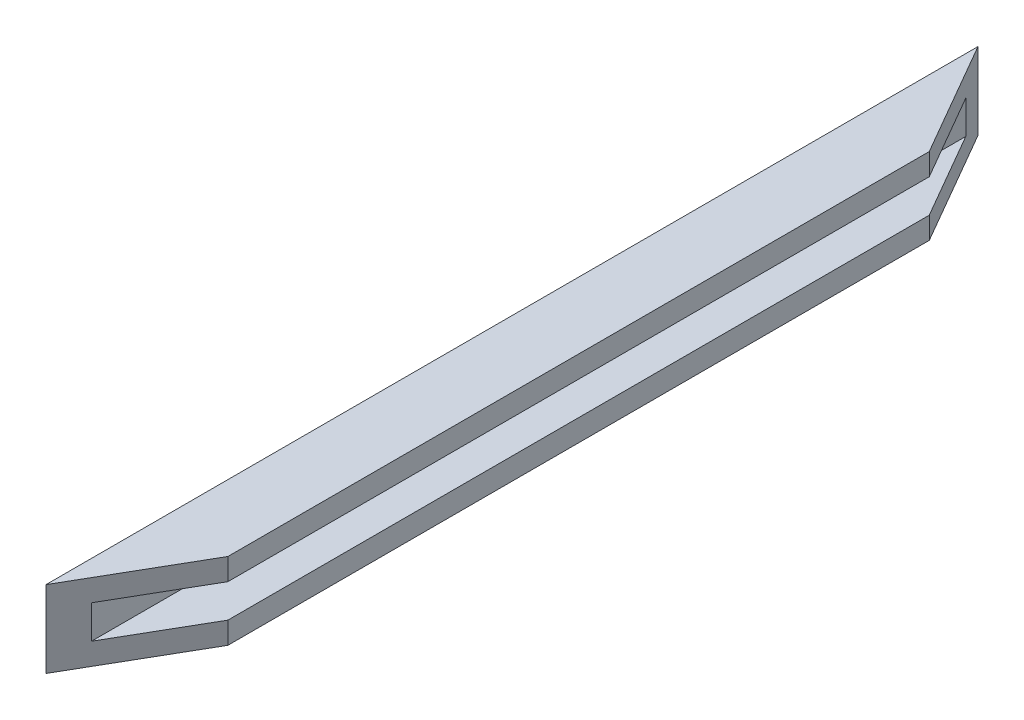
ISO-10303-21;
HEADER;
FILE_DESCRIPTION(('STEP AP214'),'2;1');
FILE_NAME('part.step','',(''),(''),'','','');
FILE_SCHEMA(('AUTOMOTIVE_DESIGN { 1 0 10303 214 1 1 1 1 }'));
ENDSEC;
DATA;
#1=APPLICATION_CONTEXT('core data for automotive mechanical design processes');
#2=APPLICATION_PROTOCOL_DEFINITION('international standard','automotive_design',2000,#1);
#3=PRODUCT_CONTEXT('',#1,'mechanical');
#4=PRODUCT('Part','Part','',(#3));
#5=PRODUCT_RELATED_PRODUCT_CATEGORY('part','',(#4));
#6=PRODUCT_DEFINITION_FORMATION('','',#4);
#7=PRODUCT_DEFINITION_CONTEXT('part definition',#1,'design');
#8=PRODUCT_DEFINITION('design','',#6,#7);
#9=PRODUCT_DEFINITION_SHAPE('','',#8);
#10=(LENGTH_UNIT() NAMED_UNIT(*) SI_UNIT(.MILLI.,.METRE.));
#11=(NAMED_UNIT(*) PLANE_ANGLE_UNIT() SI_UNIT($,.RADIAN.));
#12=(NAMED_UNIT(*) SI_UNIT($,.STERADIAN.) SOLID_ANGLE_UNIT());
#13=UNCERTAINTY_MEASURE_WITH_UNIT(LENGTH_MEASURE(1.E-05),#10,'distance_accuracy_value','');
#14=(GEOMETRIC_REPRESENTATION_CONTEXT(3) GLOBAL_UNCERTAINTY_ASSIGNED_CONTEXT((#13)) GLOBAL_UNIT_ASSIGNED_CONTEXT((#10,
#11,#12)) REPRESENTATION_CONTEXT('',''));
#15=CARTESIAN_POINT('',(0.,0.,0.));
#16=DIRECTION('',(0.,0.,1.));
#17=DIRECTION('',(1.,0.,0.));
#18=AXIS2_PLACEMENT_3D('',#15,#16,#17);
#19=CARTESIAN_POINT('',(6.35,0.,0.));
#20=DIRECTION('',(-1.,0.,0.));
#21=DIRECTION('',(0.,0.,1.));
#22=AXIS2_PLACEMENT_3D('',#19,#20,#21);
#23=PLANE('',#22);
#24=DIRECTION('',(0.,0.,-1.));
#25=VECTOR('',#24,1.);
#26=CARTESIAN_POINT('',(6.35,7.3406,0.));
#27=LINE('',#26,#25);
#28=CARTESIAN_POINT('',(6.34999999999999,7.3406,-10.9985226280623));
#29=VERTEX_POINT('',#28);
#30=CARTESIAN_POINT('',(6.35,7.3406,-77.9014773719377));
#31=VERTEX_POINT('',#30);
#32=EDGE_CURVE('E144',#29,#31,#27,.T.);
#33=ORIENTED_EDGE('',*,*,#32,.F.);
#34=DIRECTION('',(0.,-1.,0.));
#35=VECTOR('',#34,1.);
#36=CARTESIAN_POINT('',(6.34999999999999,7.3406,-10.9985226280623));
#37=LINE('',#36,#35);
#38=CARTESIAN_POINT('',(6.34999999999999,5.25780000000002,-10.9985226280623));
#39=VERTEX_POINT('',#38);
#40=EDGE_CURVE('E109',#29,#39,#37,.T.);
#41=ORIENTED_EDGE('',*,*,#40,.T.);
#42=DIRECTION('',(0.,0.,-1.));
#43=VECTOR('',#42,1.);
#44=CARTESIAN_POINT('',(6.35,5.25780000000002,0.));
#45=LINE('',#44,#43);
#46=CARTESIAN_POINT('',(6.35,5.25780000000001,-77.9014773719377));
#47=VERTEX_POINT('',#46);
#48=EDGE_CURVE('E155',#39,#47,#45,.T.);
#49=ORIENTED_EDGE('',*,*,#48,.T.);
#50=DIRECTION('',(0.,-1.,0.));
#51=VECTOR('',#50,1.);
#52=CARTESIAN_POINT('',(6.35,7.3406,-77.9014773719377));
#53=LINE('',#52,#51);
#54=EDGE_CURVE('E176',#31,#47,#53,.T.);
#55=ORIENTED_EDGE('',*,*,#54,.F.);
#56=EDGE_LOOP('',(#33,#41,#49,#55));
#57=FACE_BOUND('',#56,.T.);
#58=ADVANCED_FACE('F39',(#57),#23,.F.);
#59=CARTESIAN_POINT('',(6.35,0.,0.));
#60=DIRECTION('',(0.,1.,0.));
#61=DIRECTION('',(0.,0.,1.));
#62=AXIS2_PLACEMENT_3D('',#59,#60,#61);
#63=PLANE('',#62);
#64=DIRECTION('',(0.,0.,-1.));
#65=VECTOR('',#64,1.);
#66=CARTESIAN_POINT('',(6.35,0.,0.));
#67=LINE('',#66,#65);
#68=CARTESIAN_POINT('',(6.34999999999999,0.,-10.9985226280623));
#69=VERTEX_POINT('',#68);
#70=CARTESIAN_POINT('',(6.35,0.,-77.9014773719377));
#71=VERTEX_POINT('',#70);
#72=EDGE_CURVE('E138',#69,#71,#67,.T.);
#73=ORIENTED_EDGE('',*,*,#72,.F.);
#74=DIRECTION('',(0.500000000000001,0.,-0.866025403784438));
#75=VECTOR('',#74,1.);
#76=CARTESIAN_POINT('',(0.,0.,0.));
#77=LINE('',#76,#75);
#78=CARTESIAN_POINT('',(0.,0.,0.));
#79=VERTEX_POINT('',#78);
#80=EDGE_CURVE('E115',#79,#69,#77,.T.);
#81=ORIENTED_EDGE('',*,*,#80,.F.);
#82=DIRECTION('',(0.,0.,-1.));
#83=VECTOR('',#82,1.);
#84=CARTESIAN_POINT('',(0.,0.,0.));
#85=LINE('',#84,#83);
#86=CARTESIAN_POINT('',(0.,0.,-88.9));
#87=VERTEX_POINT('',#86);
#88=EDGE_CURVE('E129',#79,#87,#85,.T.);
#89=ORIENTED_EDGE('',*,*,#88,.T.);
#90=DIRECTION('',(-0.500000000000002,0.,-0.866025403784438));
#91=VECTOR('',#90,1.);
#92=CARTESIAN_POINT('',(0.,0.,-88.9));
#93=LINE('',#92,#91);
#94=EDGE_CURVE('E180',#71,#87,#93,.T.);
#95=ORIENTED_EDGE('',*,*,#94,.F.);
#96=EDGE_LOOP('',(#73,#81,#89,#95));
#97=FACE_BOUND('',#96,.T.);
#98=ADVANCED_FACE('F247',(#97),#63,.F.);
#99=CARTESIAN_POINT('',(6.35,7.3406,0.));
#100=DIRECTION('',(0.,1.,0.));
#101=DIRECTION('',(0.,0.,1.));
#102=AXIS2_PLACEMENT_3D('',#99,#100,#101);
#103=PLANE('',#102);
#104=DIRECTION('',(0.500000000000001,0.,-0.866025403784438));
#105=VECTOR('',#104,1.);
#106=CARTESIAN_POINT('',(0.,7.3406,0.));
#107=LINE('',#106,#105);
#108=CARTESIAN_POINT('',(0.,7.3406,0.));
#109=VERTEX_POINT('',#108);
#110=EDGE_CURVE('E102',#109,#29,#107,.T.);
#111=ORIENTED_EDGE('',*,*,#110,.T.);
#112=ORIENTED_EDGE('',*,*,#32,.T.);
#113=DIRECTION('',(-0.500000000000002,0.,-0.866025403784438));
#114=VECTOR('',#113,1.);
#115=CARTESIAN_POINT('',(0.,7.3406,-88.9));
#116=LINE('',#115,#114);
#117=CARTESIAN_POINT('',(0.,7.3406,-88.9));
#118=VERTEX_POINT('',#117);
#119=EDGE_CURVE('E120',#31,#118,#116,.T.);
#120=ORIENTED_EDGE('',*,*,#119,.T.);
#121=DIRECTION('',(0.,0.,-1.));
#122=VECTOR('',#121,1.);
#123=CARTESIAN_POINT('',(0.,7.3406,0.));
#124=LINE('',#123,#122);
#125=EDGE_CURVE('E119',#109,#118,#124,.T.);
#126=ORIENTED_EDGE('',*,*,#125,.F.);
#127=EDGE_LOOP('',(#111,#112,#120,#126));
#128=FACE_BOUND('',#127,.T.);
#129=ADVANCED_FACE('F41',(#128),#103,.T.);
#130=DIRECTION('',(0.,0.,-1.));
#131=VECTOR('',#130,1.);
#132=CARTESIAN_POINT('',(6.35,2.08280000000002,0.));
#133=LINE('',#132,#131);
#134=CARTESIAN_POINT('',(6.34999999999999,2.08280000000002,-10.9985226280623));
#135=VERTEX_POINT('',#134);
#136=CARTESIAN_POINT('',(6.35,2.08280000000001,-77.9014773719377));
#137=VERTEX_POINT('',#136);
#138=EDGE_CURVE('E159',#135,#137,#133,.T.);
#139=ORIENTED_EDGE('',*,*,#138,.F.);
#140=EDGE_CURVE('E114',#135,#69,#37,.T.);
#141=ORIENTED_EDGE('',*,*,#140,.T.);
#142=ORIENTED_EDGE('',*,*,#72,.T.);
#143=EDGE_CURVE('E179',#137,#71,#53,.T.);
#144=ORIENTED_EDGE('',*,*,#143,.F.);
#145=EDGE_LOOP('',(#139,#141,#142,#144));
#146=FACE_BOUND('',#145,.T.);
#147=ADVANCED_FACE('F227',(#146),#23,.F.);
#148=CARTESIAN_POINT('',(0.,0.,0.));
#149=DIRECTION('',(-1.,0.,0.));
#150=DIRECTION('',(0.,0.,1.));
#151=AXIS2_PLACEMENT_3D('',#148,#149,#150);
#152=PLANE('',#151);
#153=CARTESIAN_POINT('',(0.,3.67029999999998,-76.2));
#154=DIRECTION('',(-1.,0.,0.));
#155=DIRECTION('',(0.,0.,1.));
#156=AXIS2_PLACEMENT_3D('',#153,#154,#155);
#157=CIRCLE('',#156,1.025);
#158=CARTESIAN_POINT('',(0.,3.67029999999998,-75.175));
#159=VERTEX_POINT('',#158);
#160=EDGE_CURVE('E206',#159,#159,#157,.T.);
#161=ORIENTED_EDGE('',*,*,#160,.F.);
#162=EDGE_LOOP('',(#161));
#163=FACE_BOUND('',#162,.T.);
#164=CARTESIAN_POINT('',(0.,3.67029999999999,-44.45));
#165=DIRECTION('',(-1.,0.,0.));
#166=DIRECTION('',(0.,0.,1.));
#167=AXIS2_PLACEMENT_3D('',#164,#165,#166);
#168=CIRCLE('',#167,1.025);
#169=CARTESIAN_POINT('',(0.,3.67029999999999,-43.425));
#170=VERTEX_POINT('',#169);
#171=EDGE_CURVE('E198',#170,#170,#168,.T.);
#172=ORIENTED_EDGE('',*,*,#171,.F.);
#173=EDGE_LOOP('',(#172));
#174=FACE_BOUND('',#173,.T.);
#175=CARTESIAN_POINT('',(0.,3.67029999999998,-12.7));
#176=DIRECTION('',(-1.,0.,0.));
#177=DIRECTION('',(0.,0.,-1.));
#178=AXIS2_PLACEMENT_3D('',#175,#176,#177);
#179=CIRCLE('',#178,1.025);
#180=CARTESIAN_POINT('',(0.,3.67029999999998,-13.725));
#181=VERTEX_POINT('',#180);
#182=EDGE_CURVE('E190',#181,#181,#179,.T.);
#183=ORIENTED_EDGE('',*,*,#182,.F.);
#184=EDGE_LOOP('',(#183));
#185=FACE_BOUND('',#184,.T.);
#186=DIRECTION('',(0.,1.,0.));
#187=VECTOR('',#186,1.);
#188=CARTESIAN_POINT('',(0.,0.,0.));
#189=LINE('',#188,#187);
#190=EDGE_CURVE('E106',#79,#109,#189,.T.);
#191=ORIENTED_EDGE('',*,*,#190,.T.);
#192=ORIENTED_EDGE('',*,*,#125,.T.);
#193=DIRECTION('',(0.,1.,0.));
#194=VECTOR('',#193,1.);
#195=CARTESIAN_POINT('',(0.,0.,-88.9));
#196=LINE('',#195,#194);
#197=EDGE_CURVE('E124',#87,#118,#196,.T.);
#198=ORIENTED_EDGE('',*,*,#197,.F.);
#199=ORIENTED_EDGE('',*,*,#88,.F.);
#200=EDGE_LOOP('',(#191,#192,#198,#199));
#201=FACE_BOUND('',#200,.T.);
#202=ADVANCED_FACE('F127',(#163,#174,#185,#201),#152,.T.);
#203=CARTESIAN_POINT('',(1.5875,5.25780000000002,0.));
#204=DIRECTION('',(0.,-1.,0.));
#205=DIRECTION('',(0.,0.,-1.));
#206=AXIS2_PLACEMENT_3D('',#203,#204,#205);
#207=PLANE('',#206);
#208=DIRECTION('',(0.500000000000001,0.,-0.866025403784438));
#209=VECTOR('',#208,1.);
#210=CARTESIAN_POINT('',(0.396874999999998,5.25780000000002,-0.687407664253892));
#211=LINE('',#210,#209);
#212=CARTESIAN_POINT('',(1.5875,5.25780000000002,-2.74963065701558));
#213=VERTEX_POINT('',#212);
#214=EDGE_CURVE('E162',#213,#39,#211,.T.);
#215=ORIENTED_EDGE('',*,*,#214,.F.);
#216=DIRECTION('',(0.,0.,-1.));
#217=VECTOR('',#216,1.);
#218=CARTESIAN_POINT('',(1.5875,5.25780000000002,0.));
#219=LINE('',#218,#217);
#220=CARTESIAN_POINT('',(1.5875,5.25780000000001,-86.1503693429844));
#221=VERTEX_POINT('',#220);
#222=EDGE_CURVE('E131',#213,#221,#219,.T.);
#223=ORIENTED_EDGE('',*,*,#222,.T.);
#224=DIRECTION('',(-0.500000000000002,0.,-0.866025403784438));
#225=VECTOR('',#224,1.);
#226=CARTESIAN_POINT('',(38.8917041982184,5.25780000000002,-21.5375923357462));
#227=LINE('',#226,#225);
#228=EDGE_CURVE('E55',#47,#221,#227,.T.);
#229=ORIENTED_EDGE('',*,*,#228,.F.);
#230=ORIENTED_EDGE('',*,*,#48,.F.);
#231=EDGE_LOOP('',(#215,#223,#229,#230));
#232=FACE_BOUND('',#231,.T.);
#233=ADVANCED_FACE('F226',(#232),#207,.T.);
#234=CARTESIAN_POINT('',(1.5875,2.08280000000002,0.));
#235=DIRECTION('',(0.,-1.,0.));
#236=DIRECTION('',(0.,0.,-1.));
#237=AXIS2_PLACEMENT_3D('',#234,#235,#236);
#238=PLANE('',#237);
#239=DIRECTION('',(0.,0.,-1.));
#240=VECTOR('',#239,1.);
#241=CARTESIAN_POINT('',(1.5875,2.08280000000002,0.));
#242=LINE('',#241,#240);
#243=CARTESIAN_POINT('',(1.5875,2.08280000000002,-2.74963065701558));
#244=VERTEX_POINT('',#243);
#245=CARTESIAN_POINT('',(1.5875,2.08280000000001,-86.1503693429844));
#246=VERTEX_POINT('',#245);
#247=EDGE_CURVE('E135',#244,#246,#242,.T.);
#248=ORIENTED_EDGE('',*,*,#247,.F.);
#249=DIRECTION('',(0.500000000000001,0.,-0.866025403784438));
#250=VECTOR('',#249,1.);
#251=CARTESIAN_POINT('',(0.396874999999998,2.08280000000002,-0.687407664253892));
#252=LINE('',#251,#250);
#253=EDGE_CURVE('E62',#244,#135,#252,.T.);
#254=ORIENTED_EDGE('',*,*,#253,.T.);
#255=ORIENTED_EDGE('',*,*,#138,.T.);
#256=DIRECTION('',(-0.500000000000002,0.,-0.866025403784438));
#257=VECTOR('',#256,1.);
#258=CARTESIAN_POINT('',(38.8917041982184,2.08280000000002,-21.5375923357462));
#259=LINE('',#258,#257);
#260=EDGE_CURVE('E173',#137,#246,#259,.T.);
#261=ORIENTED_EDGE('',*,*,#260,.T.);
#262=EDGE_LOOP('',(#248,#254,#255,#261));
#263=FACE_BOUND('',#262,.T.);
#264=ADVANCED_FACE('F262',(#263),#238,.F.);
#265=CARTESIAN_POINT('',(1.5875,0.,0.));
#266=DIRECTION('',(1.,0.,0.));
#267=DIRECTION('',(0.,0.,-1.));
#268=AXIS2_PLACEMENT_3D('',#265,#266,#267);
#269=PLANE('',#268);
#270=CARTESIAN_POINT('',(1.5875,3.67029999999998,-76.2));
#271=DIRECTION('',(-1.,0.,0.));
#272=DIRECTION('',(0.,0.,1.));
#273=AXIS2_PLACEMENT_3D('',#270,#271,#272);
#274=CIRCLE('',#273,1.025);
#275=CARTESIAN_POINT('',(1.5875,3.67029999999998,-75.175));
#276=VERTEX_POINT('',#275);
#277=EDGE_CURVE('E183',#276,#276,#274,.T.);
#278=ORIENTED_EDGE('',*,*,#277,.T.);
#279=EDGE_LOOP('',(#278));
#280=FACE_BOUND('',#279,.T.);
#281=CARTESIAN_POINT('',(1.5875,3.67029999999999,-44.45));
#282=DIRECTION('',(-1.,0.,0.));
#283=DIRECTION('',(0.,0.,1.));
#284=AXIS2_PLACEMENT_3D('',#281,#282,#283);
#285=CIRCLE('',#284,1.025);
#286=CARTESIAN_POINT('',(1.5875,3.67029999999999,-43.425));
#287=VERTEX_POINT('',#286);
#288=EDGE_CURVE('E202',#287,#287,#285,.T.);
#289=ORIENTED_EDGE('',*,*,#288,.T.);
#290=EDGE_LOOP('',(#289));
#291=FACE_BOUND('',#290,.T.);
#292=CARTESIAN_POINT('',(1.5875,3.67029999999998,-12.7));
#293=DIRECTION('',(-1.,0.,0.));
#294=DIRECTION('',(0.,0.,-1.));
#295=AXIS2_PLACEMENT_3D('',#292,#293,#294);
#296=CIRCLE('',#295,1.025);
#297=CARTESIAN_POINT('',(1.5875,3.67029999999998,-13.725));
#298=VERTEX_POINT('',#297);
#299=EDGE_CURVE('E194',#298,#298,#296,.T.);
#300=ORIENTED_EDGE('',*,*,#299,.T.);
#301=EDGE_LOOP('',(#300));
#302=FACE_BOUND('',#301,.T.);
#303=DIRECTION('',(0.,1.,0.));
#304=VECTOR('',#303,1.);
#305=CARTESIAN_POINT('',(1.5875,0.,-2.74963065701558));
#306=LINE('',#305,#304);
#307=EDGE_CURVE('E11',#244,#213,#306,.T.);
#308=ORIENTED_EDGE('',*,*,#307,.F.);
#309=ORIENTED_EDGE('',*,*,#247,.T.);
#310=DIRECTION('',(0.,-1.,0.));
#311=VECTOR('',#310,1.);
#312=CARTESIAN_POINT('',(1.5875,0.,-86.1503693429844));
#313=LINE('',#312,#311);
#314=EDGE_CURVE('E48',#221,#246,#313,.T.);
#315=ORIENTED_EDGE('',*,*,#314,.F.);
#316=ORIENTED_EDGE('',*,*,#222,.F.);
#317=EDGE_LOOP('',(#308,#309,#315,#316));
#318=FACE_BOUND('',#317,.T.);
#319=ADVANCED_FACE('F214',(#280,#291,#302,#318),#269,.T.);
#320=CARTESIAN_POINT('',(0.,7.3406,-88.9));
#321=DIRECTION('',(-0.866025403784438,0.,0.500000000000002));
#322=DIRECTION('',(0.500000000000002,0.,0.866025403784438));
#323=AXIS2_PLACEMENT_3D('',#320,#321,#322);
#324=PLANE('',#323);
#325=ORIENTED_EDGE('',*,*,#228,.T.);
#326=ORIENTED_EDGE('',*,*,#314,.T.);
#327=ORIENTED_EDGE('',*,*,#260,.F.);
#328=ORIENTED_EDGE('',*,*,#143,.T.);
#329=ORIENTED_EDGE('',*,*,#94,.T.);
#330=ORIENTED_EDGE('',*,*,#197,.T.);
#331=ORIENTED_EDGE('',*,*,#119,.F.);
#332=ORIENTED_EDGE('',*,*,#54,.T.);
#333=EDGE_LOOP('',(#325,#326,#327,#328,#329,#330,#331,#332));
#334=FACE_BOUND('',#333,.T.);
#335=ADVANCED_FACE('F243',(#334),#324,.F.);
#336=CARTESIAN_POINT('',(0.,7.3406,0.));
#337=DIRECTION('',(-0.866025403784438,0.,-0.500000000000001));
#338=DIRECTION('',(-0.500000000000001,0.,0.866025403784438));
#339=AXIS2_PLACEMENT_3D('',#336,#337,#338);
#340=PLANE('',#339);
#341=ORIENTED_EDGE('',*,*,#214,.T.);
#342=ORIENTED_EDGE('',*,*,#40,.F.);
#343=ORIENTED_EDGE('',*,*,#110,.F.);
#344=ORIENTED_EDGE('',*,*,#190,.F.);
#345=ORIENTED_EDGE('',*,*,#80,.T.);
#346=ORIENTED_EDGE('',*,*,#140,.F.);
#347=ORIENTED_EDGE('',*,*,#253,.F.);
#348=ORIENTED_EDGE('',*,*,#307,.T.);
#349=EDGE_LOOP('',(#341,#342,#343,#344,#345,#346,#347,#348));
#350=FACE_BOUND('',#349,.T.);
#351=ADVANCED_FACE('F104',(#350),#340,.F.);
#352=CARTESIAN_POINT('',(1.5875,3.67029999999998,-12.7));
#353=DIRECTION('',(-1.,0.,0.));
#354=DIRECTION('',(0.,0.,1.));
#355=AXIS2_PLACEMENT_3D('',#352,#353,#354);
#356=CYLINDRICAL_SURFACE('',#355,1.025);
#357=ORIENTED_EDGE('',*,*,#299,.F.);
#358=EDGE_LOOP('',(#357));
#359=FACE_BOUND('',#358,.T.);
#360=ORIENTED_EDGE('',*,*,#182,.T.);
#361=EDGE_LOOP('',(#360));
#362=FACE_BOUND('',#361,.T.);
#363=ADVANCED_FACE('F233',(#359,#362),#356,.F.);
#364=CARTESIAN_POINT('',(1.5875,3.67029999999999,-44.45));
#365=DIRECTION('',(-1.,0.,0.));
#366=DIRECTION('',(0.,0.,1.));
#367=AXIS2_PLACEMENT_3D('',#364,#365,#366);
#368=CYLINDRICAL_SURFACE('',#367,1.025);
#369=ORIENTED_EDGE('',*,*,#288,.F.);
#370=EDGE_LOOP('',(#369));
#371=FACE_BOUND('',#370,.T.);
#372=ORIENTED_EDGE('',*,*,#171,.T.);
#373=EDGE_LOOP('',(#372));
#374=FACE_BOUND('',#373,.T.);
#375=ADVANCED_FACE('F220',(#371,#374),#368,.F.);
#376=CARTESIAN_POINT('',(1.5875,3.67029999999998,-76.2));
#377=DIRECTION('',(-1.,0.,0.));
#378=DIRECTION('',(0.,0.,1.));
#379=AXIS2_PLACEMENT_3D('',#376,#377,#378);
#380=CYLINDRICAL_SURFACE('',#379,1.025);
#381=ORIENTED_EDGE('',*,*,#277,.F.);
#382=EDGE_LOOP('',(#381));
#383=FACE_BOUND('',#382,.T.);
#384=ORIENTED_EDGE('',*,*,#160,.T.);
#385=EDGE_LOOP('',(#384));
#386=FACE_BOUND('',#385,.T.);
#387=ADVANCED_FACE('F217',(#383,#386),#380,.F.);
#388=CLOSED_SHELL('',(#58,#98,#129,#147,#202,#233,#264,#319,#335,#351,#363,#375,#387));
#389=MANIFOLD_SOLID_BREP('B2',#388);
#390=ADVANCED_BREP_SHAPE_REPRESENTATION('',(#18,#389),#14);
#391=SHAPE_DEFINITION_REPRESENTATION(#9,#390);
ENDSEC;
END-ISO-10303-21;
